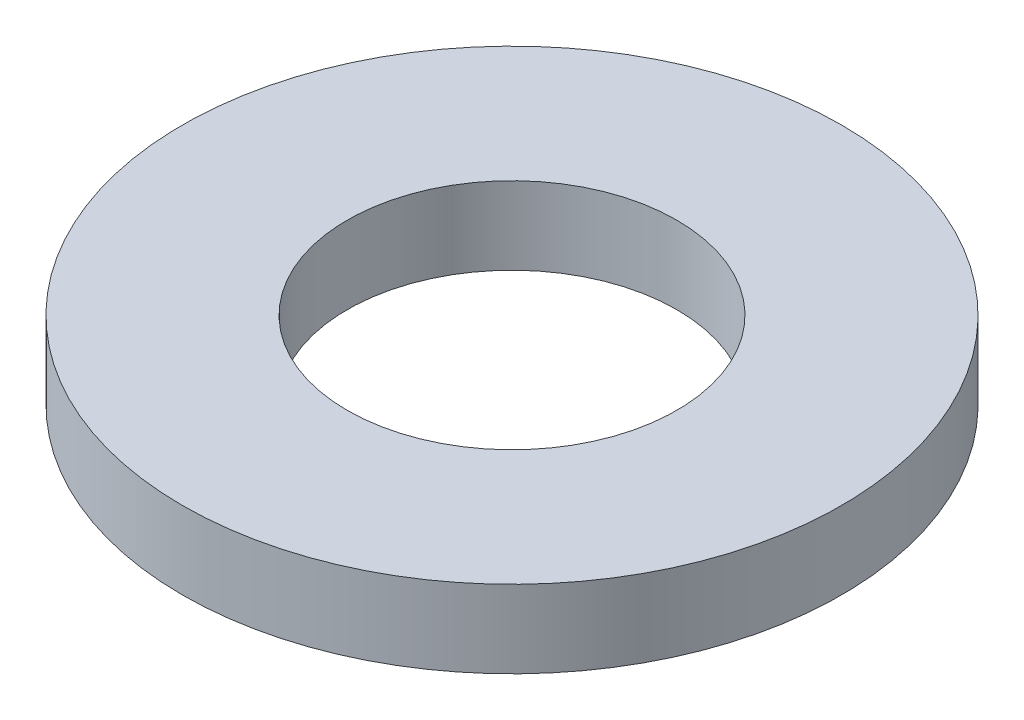
ISO-10303-21;
HEADER;
FILE_DESCRIPTION(('STEP AP214'),'2;1');
FILE_NAME('part.step','',(''),(''),'','','');
FILE_SCHEMA(('AUTOMOTIVE_DESIGN { 1 0 10303 214 1 1 1 1 }'));
ENDSEC;
DATA;
#1=APPLICATION_CONTEXT('core data for automotive mechanical design processes');
#2=APPLICATION_PROTOCOL_DEFINITION('international standard','automotive_design',2000,#1);
#3=PRODUCT_CONTEXT('',#1,'mechanical');
#4=PRODUCT('Part','Part','',(#3));
#5=PRODUCT_RELATED_PRODUCT_CATEGORY('part','',(#4));
#6=PRODUCT_DEFINITION_FORMATION('','',#4);
#7=PRODUCT_DEFINITION_CONTEXT('part definition',#1,'design');
#8=PRODUCT_DEFINITION('design','',#6,#7);
#9=PRODUCT_DEFINITION_SHAPE('','',#8);
#10=(LENGTH_UNIT() NAMED_UNIT(*) SI_UNIT(.MILLI.,.METRE.));
#11=(NAMED_UNIT(*) PLANE_ANGLE_UNIT() SI_UNIT($,.RADIAN.));
#12=(NAMED_UNIT(*) SI_UNIT($,.STERADIAN.) SOLID_ANGLE_UNIT());
#13=UNCERTAINTY_MEASURE_WITH_UNIT(LENGTH_MEASURE(1.E-05),#10,'distance_accuracy_value','');
#14=(GEOMETRIC_REPRESENTATION_CONTEXT(3) GLOBAL_UNCERTAINTY_ASSIGNED_CONTEXT((#13)) GLOBAL_UNIT_ASSIGNED_CONTEXT((#10,
#11,#12)) REPRESENTATION_CONTEXT('',''));
#15=CARTESIAN_POINT('',(0.,0.,0.));
#16=DIRECTION('',(0.,0.,1.));
#17=DIRECTION('',(1.,0.,0.));
#18=AXIS2_PLACEMENT_3D('',#15,#16,#17);
#19=CARTESIAN_POINT('',(0.,2.,0.));
#20=DIRECTION('',(0.,1.,0.));
#21=DIRECTION('',(0.,0.,1.));
#22=AXIS2_PLACEMENT_3D('',#19,#20,#21);
#23=PLANE('',#22);
#24=CARTESIAN_POINT('',(0.,2.,0.));
#25=DIRECTION('',(0.,1.,0.));
#26=DIRECTION('',(0.,0.,1.));
#27=AXIS2_PLACEMENT_3D('',#24,#25,#26);
#28=CIRCLE('',#27,8.5);
#29=CARTESIAN_POINT('',(0.,2.,8.5));
#30=VERTEX_POINT('',#29);
#31=EDGE_CURVE('E10',#30,#30,#28,.T.);
#32=ORIENTED_EDGE('',*,*,#31,.T.);
#33=EDGE_LOOP('',(#32));
#34=FACE_BOUND('',#33,.T.);
#35=CARTESIAN_POINT('',(0.,2.,0.));
#36=DIRECTION('',(0.,1.,0.));
#37=DIRECTION('',(0.,0.,1.));
#38=AXIS2_PLACEMENT_3D('',#35,#36,#37);
#39=CIRCLE('',#38,4.25);
#40=CARTESIAN_POINT('',(0.,2.,4.25));
#41=VERTEX_POINT('',#40);
#42=EDGE_CURVE('E45',#41,#41,#39,.T.);
#43=ORIENTED_EDGE('',*,*,#42,.F.);
#44=EDGE_LOOP('',(#43));
#45=FACE_BOUND('',#44,.T.);
#46=ADVANCED_FACE('F34',(#34,#45),#23,.T.);
#47=CARTESIAN_POINT('',(0.,0.,0.));
#48=DIRECTION('',(0.,1.,0.));
#49=DIRECTION('',(0.,0.,1.));
#50=AXIS2_PLACEMENT_3D('',#47,#48,#49);
#51=PLANE('',#50);
#52=CARTESIAN_POINT('',(0.,0.,0.));
#53=DIRECTION('',(0.,1.,0.));
#54=DIRECTION('',(0.,0.,1.));
#55=AXIS2_PLACEMENT_3D('',#52,#53,#54);
#56=CIRCLE('',#55,8.5);
#57=CARTESIAN_POINT('',(0.,0.,8.5));
#58=VERTEX_POINT('',#57);
#59=EDGE_CURVE('E38',#58,#58,#56,.T.);
#60=ORIENTED_EDGE('',*,*,#59,.F.);
#61=EDGE_LOOP('',(#60));
#62=FACE_BOUND('',#61,.T.);
#63=CARTESIAN_POINT('',(0.,0.,0.));
#64=DIRECTION('',(0.,1.,0.));
#65=DIRECTION('',(0.,0.,1.));
#66=AXIS2_PLACEMENT_3D('',#63,#64,#65);
#67=CIRCLE('',#66,4.25);
#68=CARTESIAN_POINT('',(0.,0.,4.25));
#69=VERTEX_POINT('',#68);
#70=EDGE_CURVE('E47',#69,#69,#67,.T.);
#71=ORIENTED_EDGE('',*,*,#70,.T.);
#72=EDGE_LOOP('',(#71));
#73=FACE_BOUND('',#72,.T.);
#74=ADVANCED_FACE('F57',(#62,#73),#51,.F.);
#75=CARTESIAN_POINT('',(0.,2.,0.));
#76=DIRECTION('',(0.,-1.,0.));
#77=DIRECTION('',(0.,0.,-1.));
#78=AXIS2_PLACEMENT_3D('',#75,#76,#77);
#79=CYLINDRICAL_SURFACE('',#78,8.5);
#80=ORIENTED_EDGE('',*,*,#31,.F.);
#81=EDGE_LOOP('',(#80));
#82=FACE_BOUND('',#81,.T.);
#83=ORIENTED_EDGE('',*,*,#59,.T.);
#84=EDGE_LOOP('',(#83));
#85=FACE_BOUND('',#84,.T.);
#86=ADVANCED_FACE('F36',(#82,#85),#79,.T.);
#87=CARTESIAN_POINT('',(0.,2.,0.));
#88=DIRECTION('',(0.,-1.,0.));
#89=DIRECTION('',(0.,0.,-1.));
#90=AXIS2_PLACEMENT_3D('',#87,#88,#89);
#91=CYLINDRICAL_SURFACE('',#90,4.25);
#92=ORIENTED_EDGE('',*,*,#42,.T.);
#93=EDGE_LOOP('',(#92));
#94=FACE_BOUND('',#93,.T.);
#95=ORIENTED_EDGE('',*,*,#70,.F.);
#96=EDGE_LOOP('',(#95));
#97=FACE_BOUND('',#96,.T.);
#98=ADVANCED_FACE('F53',(#94,#97),#91,.F.);
#99=CLOSED_SHELL('',(#46,#74,#86,#98));
#100=MANIFOLD_SOLID_BREP('B2',#99);
#101=ADVANCED_BREP_SHAPE_REPRESENTATION('',(#18,#100),#14);
#102=SHAPE_DEFINITION_REPRESENTATION(#9,#101);
ENDSEC;
END-ISO-10303-21;
